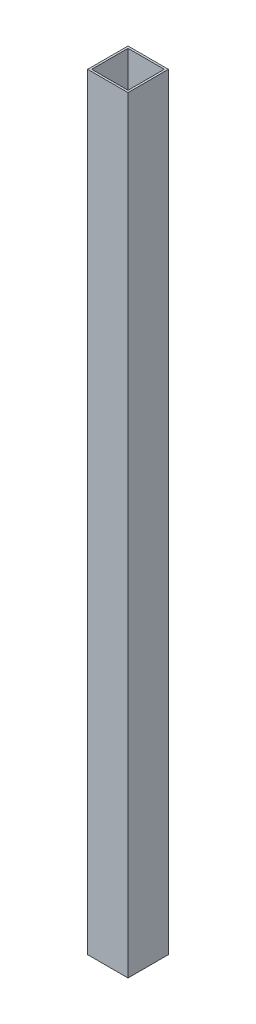
ISO-10303-21;
HEADER;
FILE_DESCRIPTION(('STEP AP214'),'2;1');
FILE_NAME('part.step','',(''),(''),'','','');
FILE_SCHEMA(('AUTOMOTIVE_DESIGN { 1 0 10303 214 1 1 1 1 }'));
ENDSEC;
DATA;
#1=APPLICATION_CONTEXT('core data for automotive mechanical design processes');
#2=APPLICATION_PROTOCOL_DEFINITION('international standard','automotive_design',2000,#1);
#3=PRODUCT_CONTEXT('',#1,'mechanical');
#4=PRODUCT('Part','Part','',(#3));
#5=PRODUCT_RELATED_PRODUCT_CATEGORY('part','',(#4));
#6=PRODUCT_DEFINITION_FORMATION('','',#4);
#7=PRODUCT_DEFINITION_CONTEXT('part definition',#1,'design');
#8=PRODUCT_DEFINITION('design','',#6,#7);
#9=PRODUCT_DEFINITION_SHAPE('','',#8);
#10=(LENGTH_UNIT() NAMED_UNIT(*) SI_UNIT(.MILLI.,.METRE.));
#11=(NAMED_UNIT(*) PLANE_ANGLE_UNIT() SI_UNIT($,.RADIAN.));
#12=(NAMED_UNIT(*) SI_UNIT($,.STERADIAN.) SOLID_ANGLE_UNIT());
#13=UNCERTAINTY_MEASURE_WITH_UNIT(LENGTH_MEASURE(1.E-05),#10,'distance_accuracy_value','');
#14=(GEOMETRIC_REPRESENTATION_CONTEXT(3) GLOBAL_UNCERTAINTY_ASSIGNED_CONTEXT((#13)) GLOBAL_UNIT_ASSIGNED_CONTEXT((#10,
#11,#12)) REPRESENTATION_CONTEXT('',''));
#15=CARTESIAN_POINT('',(0.,0.,0.));
#16=DIRECTION('',(0.,0.,1.));
#17=DIRECTION('',(1.,0.,0.));
#18=AXIS2_PLACEMENT_3D('',#15,#16,#17);
#19=CARTESIAN_POINT('',(0.,482.6,0.));
#20=DIRECTION('',(0.,-1.,0.));
#21=DIRECTION('',(0.,0.,-1.));
#22=AXIS2_PLACEMENT_3D('',#19,#20,#21);
#23=PLANE('',#22);
#24=DIRECTION('',(1.,0.,0.));
#25=VECTOR('',#24,1.);
#26=CARTESIAN_POINT('',(25.4,482.6,0.));
#27=LINE('',#26,#25);
#28=CARTESIAN_POINT('',(0.,482.6,0.));
#29=VERTEX_POINT('',#28);
#30=CARTESIAN_POINT('',(25.4,482.6,0.));
#31=VERTEX_POINT('',#30);
#32=EDGE_CURVE('E139',#29,#31,#27,.T.);
#33=ORIENTED_EDGE('',*,*,#32,.T.);
#34=DIRECTION('',(0.,0.,-1.));
#35=VECTOR('',#34,1.);
#36=CARTESIAN_POINT('',(25.4,482.6,-25.4));
#37=LINE('',#36,#35);
#38=CARTESIAN_POINT('',(25.4,482.6,-25.4));
#39=VERTEX_POINT('',#38);
#40=EDGE_CURVE('E142',#31,#39,#37,.T.);
#41=ORIENTED_EDGE('',*,*,#40,.T.);
#42=DIRECTION('',(-1.,0.,0.));
#43=VECTOR('',#42,1.);
#44=CARTESIAN_POINT('',(0.,482.6,-25.4));
#45=LINE('',#44,#43);
#46=CARTESIAN_POINT('',(0.,482.6,-25.4));
#47=VERTEX_POINT('',#46);
#48=EDGE_CURVE('E145',#39,#47,#45,.T.);
#49=ORIENTED_EDGE('',*,*,#48,.T.);
#50=DIRECTION('',(0.,0.,1.));
#51=VECTOR('',#50,1.);
#52=CARTESIAN_POINT('',(0.,482.6,0.));
#53=LINE('',#52,#51);
#54=EDGE_CURVE('E147',#47,#29,#53,.T.);
#55=ORIENTED_EDGE('',*,*,#54,.T.);
#56=EDGE_LOOP('',(#33,#41,#49,#55));
#57=FACE_BOUND('',#56,.T.);
#58=DIRECTION('',(1.,0.,0.));
#59=VECTOR('',#58,1.);
#60=CARTESIAN_POINT('',(1.27,482.6,-1.27));
#61=LINE('',#60,#59);
#62=CARTESIAN_POINT('',(1.27,482.6,-1.27));
#63=VERTEX_POINT('',#62);
#64=CARTESIAN_POINT('',(24.13,482.6,-1.27));
#65=VERTEX_POINT('',#64);
#66=EDGE_CURVE('E105',#63,#65,#61,.T.);
#67=ORIENTED_EDGE('',*,*,#66,.F.);
#68=DIRECTION('',(0.,0.,1.));
#69=VECTOR('',#68,1.);
#70=CARTESIAN_POINT('',(1.27,482.6,-12.3614591557052));
#71=LINE('',#70,#69);
#72=CARTESIAN_POINT('',(1.27,482.6,-24.13));
#73=VERTEX_POINT('',#72);
#74=EDGE_CURVE('E100',#73,#63,#71,.T.);
#75=ORIENTED_EDGE('',*,*,#74,.F.);
#76=DIRECTION('',(-1.,0.,0.));
#77=VECTOR('',#76,1.);
#78=CARTESIAN_POINT('',(12.7,482.6,-24.13));
#79=LINE('',#78,#77);
#80=CARTESIAN_POINT('',(24.13,482.6,-24.13));
#81=VERTEX_POINT('',#80);
#82=EDGE_CURVE('E121',#81,#73,#79,.T.);
#83=ORIENTED_EDGE('',*,*,#82,.F.);
#84=DIRECTION('',(0.,0.,-1.));
#85=VECTOR('',#84,1.);
#86=CARTESIAN_POINT('',(24.13,482.6,-1.27));
#87=LINE('',#86,#85);
#88=EDGE_CURVE('E119',#65,#81,#87,.T.);
#89=ORIENTED_EDGE('',*,*,#88,.F.);
#90=EDGE_LOOP('',(#67,#75,#83,#89));
#91=FACE_BOUND('',#90,.T.);
#92=ADVANCED_FACE('F37',(#57,#91),#23,.F.);
#93=CARTESIAN_POINT('',(0.,0.,0.));
#94=DIRECTION('',(0.,-1.,0.));
#95=DIRECTION('',(0.,0.,-1.));
#96=AXIS2_PLACEMENT_3D('',#93,#94,#95);
#97=PLANE('',#96);
#98=DIRECTION('',(1.,0.,0.));
#99=VECTOR('',#98,1.);
#100=CARTESIAN_POINT('',(25.4,0.,0.));
#101=LINE('',#100,#99);
#102=CARTESIAN_POINT('',(0.,0.,0.));
#103=VERTEX_POINT('',#102);
#104=CARTESIAN_POINT('',(25.4,0.,0.));
#105=VERTEX_POINT('',#104);
#106=EDGE_CURVE('E115',#103,#105,#101,.T.);
#107=ORIENTED_EDGE('',*,*,#106,.F.);
#108=DIRECTION('',(0.,0.,1.));
#109=VECTOR('',#108,1.);
#110=CARTESIAN_POINT('',(0.,0.,0.));
#111=LINE('',#110,#109);
#112=CARTESIAN_POINT('',(0.,0.,-25.4));
#113=VERTEX_POINT('',#112);
#114=EDGE_CURVE('E143',#113,#103,#111,.T.);
#115=ORIENTED_EDGE('',*,*,#114,.F.);
#116=DIRECTION('',(-1.,0.,0.));
#117=VECTOR('',#116,1.);
#118=CARTESIAN_POINT('',(0.,0.,-25.4));
#119=LINE('',#118,#117);
#120=CARTESIAN_POINT('',(25.4,0.,-25.4));
#121=VERTEX_POINT('',#120);
#122=EDGE_CURVE('E154',#121,#113,#119,.T.);
#123=ORIENTED_EDGE('',*,*,#122,.F.);
#124=DIRECTION('',(0.,0.,-1.));
#125=VECTOR('',#124,1.);
#126=CARTESIAN_POINT('',(25.4,0.,-25.4));
#127=LINE('',#126,#125);
#128=EDGE_CURVE('E152',#105,#121,#127,.T.);
#129=ORIENTED_EDGE('',*,*,#128,.F.);
#130=EDGE_LOOP('',(#107,#115,#123,#129));
#131=FACE_BOUND('',#130,.T.);
#132=DIRECTION('',(0.,0.,1.));
#133=VECTOR('',#132,1.);
#134=CARTESIAN_POINT('',(1.27,0.,-12.3614591557052));
#135=LINE('',#134,#133);
#136=CARTESIAN_POINT('',(1.27,0.,-24.13));
#137=VERTEX_POINT('',#136);
#138=CARTESIAN_POINT('',(1.27,0.,-1.27));
#139=VERTEX_POINT('',#138);
#140=EDGE_CURVE('E106',#137,#139,#135,.T.);
#141=ORIENTED_EDGE('',*,*,#140,.T.);
#142=DIRECTION('',(1.,0.,0.));
#143=VECTOR('',#142,1.);
#144=CARTESIAN_POINT('',(24.13,0.,-1.27));
#145=LINE('',#144,#143);
#146=CARTESIAN_POINT('',(24.13,0.,-1.27));
#147=VERTEX_POINT('',#146);
#148=EDGE_CURVE('E113',#139,#147,#145,.T.);
#149=ORIENTED_EDGE('',*,*,#148,.T.);
#150=DIRECTION('',(0.,0.,-1.));
#151=VECTOR('',#150,1.);
#152=CARTESIAN_POINT('',(24.13,0.,-24.13));
#153=LINE('',#152,#151);
#154=CARTESIAN_POINT('',(24.13,0.,-24.13));
#155=VERTEX_POINT('',#154);
#156=EDGE_CURVE('E127',#147,#155,#153,.T.);
#157=ORIENTED_EDGE('',*,*,#156,.T.);
#158=DIRECTION('',(-1.,0.,0.));
#159=VECTOR('',#158,1.);
#160=CARTESIAN_POINT('',(1.27,0.,-24.13));
#161=LINE('',#160,#159);
#162=EDGE_CURVE('E130',#155,#137,#161,.T.);
#163=ORIENTED_EDGE('',*,*,#162,.T.);
#164=EDGE_LOOP('',(#141,#149,#157,#163));
#165=FACE_BOUND('',#164,.T.);
#166=ADVANCED_FACE('F173',(#131,#165),#97,.T.);
#167=CARTESIAN_POINT('',(25.4,482.6,0.));
#168=DIRECTION('',(0.,0.,-1.));
#169=DIRECTION('',(-1.,0.,0.));
#170=AXIS2_PLACEMENT_3D('',#167,#168,#169);
#171=PLANE('',#170);
#172=ORIENTED_EDGE('',*,*,#106,.T.);
#173=DIRECTION('',(0.,-1.,0.));
#174=VECTOR('',#173,1.);
#175=CARTESIAN_POINT('',(25.4,482.6,0.));
#176=LINE('',#175,#174);
#177=EDGE_CURVE('E11',#31,#105,#176,.T.);
#178=ORIENTED_EDGE('',*,*,#177,.F.);
#179=ORIENTED_EDGE('',*,*,#32,.F.);
#180=DIRECTION('',(0.,-1.,0.));
#181=VECTOR('',#180,1.);
#182=CARTESIAN_POINT('',(0.,482.6,0.));
#183=LINE('',#182,#181);
#184=EDGE_CURVE('E149',#29,#103,#183,.T.);
#185=ORIENTED_EDGE('',*,*,#184,.T.);
#186=EDGE_LOOP('',(#172,#178,#179,#185));
#187=FACE_BOUND('',#186,.T.);
#188=ADVANCED_FACE('F39',(#187),#171,.F.);
#189=CARTESIAN_POINT('',(25.4,482.6,-25.4));
#190=DIRECTION('',(-1.,0.,0.));
#191=DIRECTION('',(0.,0.,1.));
#192=AXIS2_PLACEMENT_3D('',#189,#190,#191);
#193=PLANE('',#192);
#194=ORIENTED_EDGE('',*,*,#128,.T.);
#195=DIRECTION('',(0.,-1.,0.));
#196=VECTOR('',#195,1.);
#197=CARTESIAN_POINT('',(25.4,482.6,-25.4));
#198=LINE('',#197,#196);
#199=EDGE_CURVE('E46',#39,#121,#198,.T.);
#200=ORIENTED_EDGE('',*,*,#199,.F.);
#201=ORIENTED_EDGE('',*,*,#40,.F.);
#202=ORIENTED_EDGE('',*,*,#177,.T.);
#203=EDGE_LOOP('',(#194,#200,#201,#202));
#204=FACE_BOUND('',#203,.T.);
#205=ADVANCED_FACE('F183',(#204),#193,.F.);
#206=CARTESIAN_POINT('',(0.,482.6,-25.4));
#207=DIRECTION('',(0.,0.,1.));
#208=DIRECTION('',(1.,0.,0.));
#209=AXIS2_PLACEMENT_3D('',#206,#207,#208);
#210=PLANE('',#209);
#211=CARTESIAN_POINT('',(12.7,50.874750114815,-25.4));
#212=DIRECTION('',(0.,0.,-1.));
#213=DIRECTION('',(-1.,0.,0.));
#214=AXIS2_PLACEMENT_3D('',#211,#212,#213);
#215=CIRCLE('',#214,2.54);
#216=CARTESIAN_POINT('',(10.16,50.874750114815,-25.4));
#217=VERTEX_POINT('',#216);
#218=EDGE_CURVE('E228',#217,#217,#215,.T.);
#219=ORIENTED_EDGE('',*,*,#218,.F.);
#220=EDGE_LOOP('',(#219));
#221=FACE_BOUND('',#220,.T.);
#222=ORIENTED_EDGE('',*,*,#122,.T.);
#223=DIRECTION('',(0.,-1.,0.));
#224=VECTOR('',#223,1.);
#225=CARTESIAN_POINT('',(0.,482.6,-25.4));
#226=LINE('',#225,#224);
#227=EDGE_CURVE('E159',#47,#113,#226,.T.);
#228=ORIENTED_EDGE('',*,*,#227,.F.);
#229=ORIENTED_EDGE('',*,*,#48,.F.);
#230=ORIENTED_EDGE('',*,*,#199,.T.);
#231=EDGE_LOOP('',(#222,#228,#229,#230));
#232=FACE_BOUND('',#231,.T.);
#233=ADVANCED_FACE('F167',(#221,#232),#210,.F.);
#234=CARTESIAN_POINT('',(0.,482.6,0.));
#235=DIRECTION('',(1.,0.,0.));
#236=DIRECTION('',(0.,0.,-1.));
#237=AXIS2_PLACEMENT_3D('',#234,#235,#236);
#238=PLANE('',#237);
#239=ORIENTED_EDGE('',*,*,#114,.T.);
#240=ORIENTED_EDGE('',*,*,#184,.F.);
#241=ORIENTED_EDGE('',*,*,#54,.F.);
#242=ORIENTED_EDGE('',*,*,#227,.T.);
#243=EDGE_LOOP('',(#239,#240,#241,#242));
#244=FACE_BOUND('',#243,.T.);
#245=ADVANCED_FACE('F177',(#244),#238,.F.);
#246=CARTESIAN_POINT('',(24.13,482.6,-1.27));
#247=DIRECTION('',(0.,0.,-1.));
#248=DIRECTION('',(-1.,0.,0.));
#249=AXIS2_PLACEMENT_3D('',#246,#247,#248);
#250=PLANE('',#249);
#251=ORIENTED_EDGE('',*,*,#148,.F.);
#252=DIRECTION('',(0.,-1.,0.));
#253=VECTOR('',#252,1.);
#254=CARTESIAN_POINT('',(1.27,482.6,-1.27));
#255=LINE('',#254,#253);
#256=EDGE_CURVE('E58',#63,#139,#255,.T.);
#257=ORIENTED_EDGE('',*,*,#256,.F.);
#258=ORIENTED_EDGE('',*,*,#66,.T.);
#259=DIRECTION('',(0.,-1.,0.));
#260=VECTOR('',#259,1.);
#261=CARTESIAN_POINT('',(24.13,482.6,-1.27));
#262=LINE('',#261,#260);
#263=EDGE_CURVE('E116',#65,#147,#262,.T.);
#264=ORIENTED_EDGE('',*,*,#263,.T.);
#265=EDGE_LOOP('',(#251,#257,#258,#264));
#266=FACE_BOUND('',#265,.T.);
#267=ADVANCED_FACE('F109',(#266),#250,.T.);
#268=CARTESIAN_POINT('',(24.13,482.6,-24.13));
#269=DIRECTION('',(-1.,0.,0.));
#270=DIRECTION('',(0.,0.,1.));
#271=AXIS2_PLACEMENT_3D('',#268,#269,#270);
#272=PLANE('',#271);
#273=ORIENTED_EDGE('',*,*,#156,.F.);
#274=ORIENTED_EDGE('',*,*,#263,.F.);
#275=ORIENTED_EDGE('',*,*,#88,.T.);
#276=DIRECTION('',(0.,-1.,0.));
#277=VECTOR('',#276,1.);
#278=CARTESIAN_POINT('',(24.13,482.6,-24.13));
#279=LINE('',#278,#277);
#280=EDGE_CURVE('E135',#81,#155,#279,.T.);
#281=ORIENTED_EDGE('',*,*,#280,.T.);
#282=EDGE_LOOP('',(#273,#274,#275,#281));
#283=FACE_BOUND('',#282,.T.);
#284=ADVANCED_FACE('F204',(#283),#272,.T.);
#285=CARTESIAN_POINT('',(1.27,482.6,-24.13));
#286=DIRECTION('',(0.,0.,1.));
#287=DIRECTION('',(1.,0.,0.));
#288=AXIS2_PLACEMENT_3D('',#285,#286,#287);
#289=PLANE('',#288);
#290=CARTESIAN_POINT('',(12.7,50.874750114815,-24.13));
#291=DIRECTION('',(0.,0.,1.));
#292=DIRECTION('',(1.,0.,0.));
#293=AXIS2_PLACEMENT_3D('',#290,#291,#292);
#294=CIRCLE('',#293,2.54);
#295=CARTESIAN_POINT('',(15.24,50.874750114815,-24.13));
#296=VERTEX_POINT('',#295);
#297=EDGE_CURVE('E41',#296,#296,#294,.T.);
#298=ORIENTED_EDGE('',*,*,#297,.F.);
#299=EDGE_LOOP('',(#298));
#300=FACE_BOUND('',#299,.T.);
#301=ORIENTED_EDGE('',*,*,#162,.F.);
#302=ORIENTED_EDGE('',*,*,#280,.F.);
#303=ORIENTED_EDGE('',*,*,#82,.T.);
#304=DIRECTION('',(0.,-1.,0.));
#305=VECTOR('',#304,1.);
#306=CARTESIAN_POINT('',(1.27,482.6,-24.13));
#307=LINE('',#306,#305);
#308=EDGE_CURVE('E53',#73,#137,#307,.T.);
#309=ORIENTED_EDGE('',*,*,#308,.T.);
#310=EDGE_LOOP('',(#301,#302,#303,#309));
#311=FACE_BOUND('',#310,.T.);
#312=ADVANCED_FACE('F208',(#300,#311),#289,.T.);
#313=CARTESIAN_POINT('',(1.27,482.6,-12.3614591557052));
#314=DIRECTION('',(1.,0.,0.));
#315=DIRECTION('',(0.,0.,-1.));
#316=AXIS2_PLACEMENT_3D('',#313,#314,#315);
#317=PLANE('',#316);
#318=ORIENTED_EDGE('',*,*,#140,.F.);
#319=ORIENTED_EDGE('',*,*,#308,.F.);
#320=ORIENTED_EDGE('',*,*,#74,.T.);
#321=ORIENTED_EDGE('',*,*,#256,.T.);
#322=EDGE_LOOP('',(#318,#319,#320,#321));
#323=FACE_BOUND('',#322,.T.);
#324=ADVANCED_FACE('F101',(#323),#317,.T.);
#325=CARTESIAN_POINT('',(12.7,50.874750114815,-22.86));
#326=DIRECTION('',(0.,0.,-1.));
#327=DIRECTION('',(-1.,0.,0.));
#328=AXIS2_PLACEMENT_3D('',#325,#326,#327);
#329=CYLINDRICAL_SURFACE('',#328,2.54);
#330=ORIENTED_EDGE('',*,*,#297,.T.);
#331=EDGE_LOOP('',(#330));
#332=FACE_BOUND('',#331,.T.);
#333=ORIENTED_EDGE('',*,*,#218,.T.);
#334=EDGE_LOOP('',(#333));
#335=FACE_BOUND('',#334,.T.);
#336=ADVANCED_FACE('F218',(#332,#335),#329,.F.);
#337=CLOSED_SHELL('',(#92,#166,#188,#205,#233,#245,#267,#284,#312,#324,#336));
#338=MANIFOLD_SOLID_BREP('B2',#337);
#339=ADVANCED_BREP_SHAPE_REPRESENTATION('',(#18,#338),#14);
#340=SHAPE_DEFINITION_REPRESENTATION(#9,#339);
ENDSEC;
END-ISO-10303-21;
